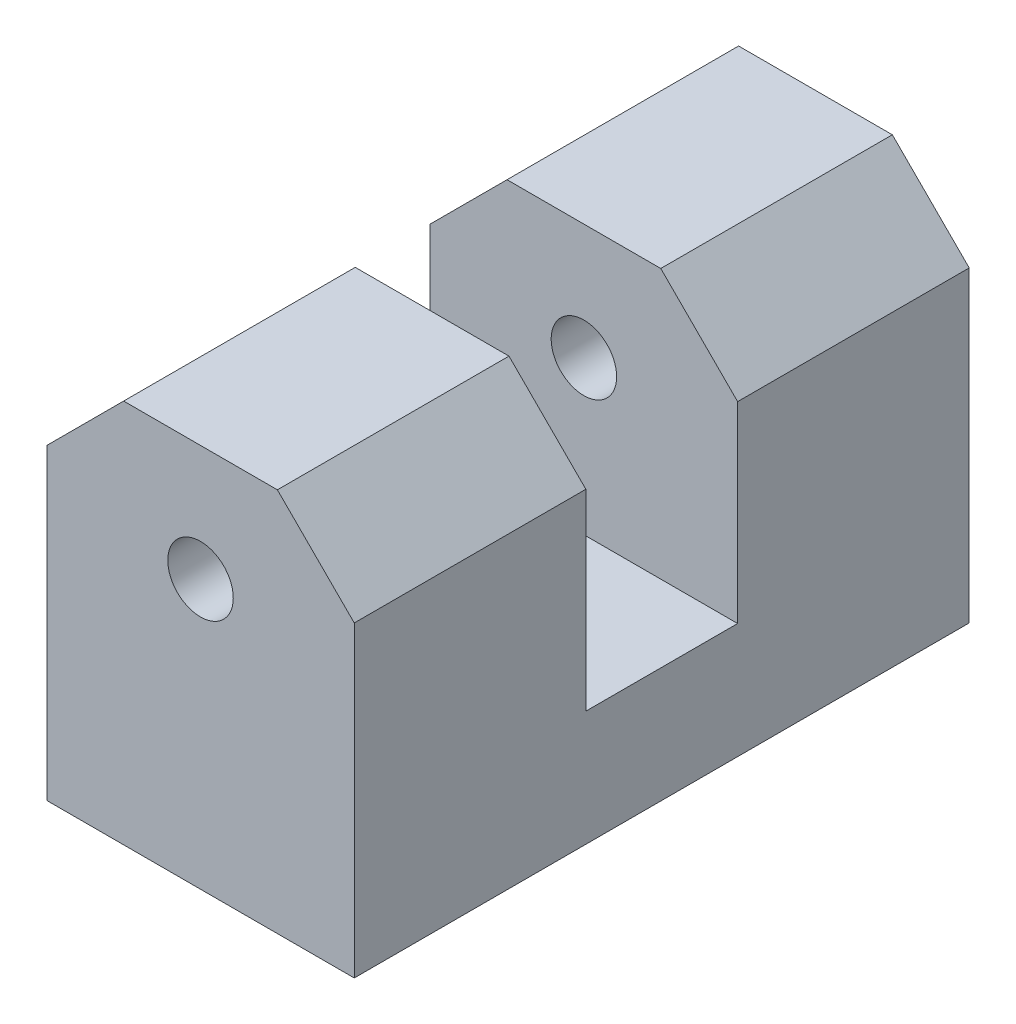
ISO-10303-21;
HEADER;
FILE_DESCRIPTION(('STEP AP214'),'2;1');
FILE_NAME('part.step','',(''),(''),'','','');
FILE_SCHEMA(('AUTOMOTIVE_DESIGN { 1 0 10303 214 1 1 1 1 }'));
ENDSEC;
DATA;
#1=APPLICATION_CONTEXT('core data for automotive mechanical design processes');
#2=APPLICATION_PROTOCOL_DEFINITION('international standard','automotive_design',2000,#1);
#3=PRODUCT_CONTEXT('',#1,'mechanical');
#4=PRODUCT('Part','Part','',(#3));
#5=PRODUCT_RELATED_PRODUCT_CATEGORY('part','',(#4));
#6=PRODUCT_DEFINITION_FORMATION('','',#4);
#7=PRODUCT_DEFINITION_CONTEXT('part definition',#1,'design');
#8=PRODUCT_DEFINITION('design','',#6,#7);
#9=PRODUCT_DEFINITION_SHAPE('','',#8);
#10=(LENGTH_UNIT() NAMED_UNIT(*) SI_UNIT(.MILLI.,.METRE.));
#11=(NAMED_UNIT(*) PLANE_ANGLE_UNIT() SI_UNIT($,.RADIAN.));
#12=(NAMED_UNIT(*) SI_UNIT($,.STERADIAN.) SOLID_ANGLE_UNIT());
#13=UNCERTAINTY_MEASURE_WITH_UNIT(LENGTH_MEASURE(1.E-05),#10,'distance_accuracy_value','');
#14=(GEOMETRIC_REPRESENTATION_CONTEXT(3) GLOBAL_UNCERTAINTY_ASSIGNED_CONTEXT((#13)) GLOBAL_UNIT_ASSIGNED_CONTEXT((#10,
#11,#12)) REPRESENTATION_CONTEXT('',''));
#15=CARTESIAN_POINT('',(0.,0.,0.));
#16=DIRECTION('',(0.,0.,1.));
#17=DIRECTION('',(1.,0.,0.));
#18=AXIS2_PLACEMENT_3D('',#15,#16,#17);
#19=CARTESIAN_POINT('',(4.,10.,8.));
#20=DIRECTION('',(0.,1.,0.));
#21=DIRECTION('',(0.,0.,1.));
#22=AXIS2_PLACEMENT_3D('',#19,#20,#21);
#23=PLANE('',#22);
#24=DIRECTION('',(1.,0.,0.));
#25=VECTOR('',#24,1.);
#26=CARTESIAN_POINT('',(-5.61776706642842,10.,1.97454128412999));
#27=LINE('',#26,#25);
#28=CARTESIAN_POINT('',(-2.,10.,1.97454128412999));
#29=VERTEX_POINT('',#28);
#30=CARTESIAN_POINT('',(2.00000000000001,10.,1.97454128412999));
#31=VERTEX_POINT('',#30);
#32=EDGE_CURVE('E144',#29,#31,#27,.T.);
#33=ORIENTED_EDGE('',*,*,#32,.F.);
#34=DIRECTION('',(0.,0.,1.));
#35=VECTOR('',#34,1.);
#36=CARTESIAN_POINT('',(-2.,10.,8.));
#37=LINE('',#36,#35);
#38=CARTESIAN_POINT('',(-2.,10.,8.));
#39=VERTEX_POINT('',#38);
#40=EDGE_CURVE('E214',#29,#39,#37,.T.);
#41=ORIENTED_EDGE('',*,*,#40,.T.);
#42=DIRECTION('',(1.,0.,0.));
#43=VECTOR('',#42,1.);
#44=CARTESIAN_POINT('',(-4.,10.,8.));
#45=LINE('',#44,#43);
#46=CARTESIAN_POINT('',(2.00000000000001,10.,8.));
#47=VERTEX_POINT('',#46);
#48=EDGE_CURVE('E165',#39,#47,#45,.T.);
#49=ORIENTED_EDGE('',*,*,#48,.T.);
#50=DIRECTION('',(0.,0.,-1.));
#51=VECTOR('',#50,1.);
#52=CARTESIAN_POINT('',(2.00000000000001,10.,1.97454128412999));
#53=LINE('',#52,#51);
#54=EDGE_CURVE('E211',#47,#31,#53,.T.);
#55=ORIENTED_EDGE('',*,*,#54,.T.);
#56=EDGE_LOOP('',(#33,#41,#49,#55));
#57=FACE_BOUND('',#56,.T.);
#58=ADVANCED_FACE('F31',(#57),#23,.T.);
#59=CARTESIAN_POINT('',(0.,6.98638723737771,-8.));
#60=DIRECTION('',(0.,0.,1.));
#61=DIRECTION('',(1.,0.,0.));
#62=AXIS2_PLACEMENT_3D('',#59,#60,#61);
#63=CYLINDRICAL_SURFACE('',#62,0.852);
#64=CARTESIAN_POINT('',(0.,6.98638723737771,1.97454128412999));
#65=DIRECTION('',(0.,0.,1.));
#66=DIRECTION('',(1.,0.,0.));
#67=AXIS2_PLACEMENT_3D('',#64,#65,#66);
#68=CIRCLE('',#67,0.852);
#69=CARTESIAN_POINT('',(0.852000000000002,6.98638723737771,1.97454128412999));
#70=VERTEX_POINT('',#69);
#71=EDGE_CURVE('E126',#70,#70,#68,.F.);
#72=ORIENTED_EDGE('',*,*,#71,.T.);
#73=EDGE_LOOP('',(#72));
#74=FACE_BOUND('',#73,.T.);
#75=CARTESIAN_POINT('',(0.,6.98638723737771,8.));
#76=DIRECTION('',(0.,0.,1.));
#77=DIRECTION('',(1.,0.,0.));
#78=AXIS2_PLACEMENT_3D('',#75,#76,#77);
#79=CIRCLE('',#78,0.852);
#80=CARTESIAN_POINT('',(0.852000000000002,6.98638723737771,8.));
#81=VERTEX_POINT('',#80);
#82=EDGE_CURVE('E138',#81,#81,#79,.T.);
#83=ORIENTED_EDGE('',*,*,#82,.T.);
#84=EDGE_LOOP('',(#83));
#85=FACE_BOUND('',#84,.T.);
#86=ADVANCED_FACE('F255',(#74,#85),#63,.F.);
#87=CARTESIAN_POINT('',(4.,10.,-8.));
#88=DIRECTION('',(-1.,0.,0.));
#89=DIRECTION('',(0.,0.,1.));
#90=AXIS2_PLACEMENT_3D('',#87,#88,#89);
#91=PLANE('',#90);
#92=DIRECTION('',(0.,-1.,0.));
#93=VECTOR('',#92,1.);
#94=CARTESIAN_POINT('',(4.,10.,-8.));
#95=LINE('',#94,#93);
#96=CARTESIAN_POINT('',(4.,7.99999999999999,-8.));
#97=VERTEX_POINT('',#96);
#98=CARTESIAN_POINT('',(4.,0.,-8.));
#99=VERTEX_POINT('',#98);
#100=EDGE_CURVE('E185',#97,#99,#95,.T.);
#101=ORIENTED_EDGE('',*,*,#100,.F.);
#102=DIRECTION('',(0.,0.,1.));
#103=VECTOR('',#102,1.);
#104=CARTESIAN_POINT('',(4.,7.99999999999999,-1.97454128412999));
#105=LINE('',#104,#103);
#106=CARTESIAN_POINT('',(4.,7.99999999999999,-1.97454128412999));
#107=VERTEX_POINT('',#106);
#108=EDGE_CURVE('E11',#97,#107,#105,.T.);
#109=ORIENTED_EDGE('',*,*,#108,.T.);
#110=DIRECTION('',(0.,-1.,0.));
#111=VECTOR('',#110,1.);
#112=CARTESIAN_POINT('',(4.,10.,-1.97454128412999));
#113=LINE('',#112,#111);
#114=CARTESIAN_POINT('',(4.,3.,-1.97454128412999));
#115=VERTEX_POINT('',#114);
#116=EDGE_CURVE('E117',#107,#115,#113,.T.);
#117=ORIENTED_EDGE('',*,*,#116,.T.);
#118=DIRECTION('',(0.,0.,-1.));
#119=VECTOR('',#118,1.);
#120=CARTESIAN_POINT('',(4.,3.,-8.));
#121=LINE('',#120,#119);
#122=CARTESIAN_POINT('',(4.,3.,1.97454128412999));
#123=VERTEX_POINT('',#122);
#124=EDGE_CURVE('E121',#123,#115,#121,.T.);
#125=ORIENTED_EDGE('',*,*,#124,.F.);
#126=DIRECTION('',(0.,1.,0.));
#127=VECTOR('',#126,1.);
#128=CARTESIAN_POINT('',(4.,10.,1.97454128412999));
#129=LINE('',#128,#127);
#130=CARTESIAN_POINT('',(4.,7.99999999999999,1.97454128412999));
#131=VERTEX_POINT('',#130);
#132=EDGE_CURVE('E139',#123,#131,#129,.T.);
#133=ORIENTED_EDGE('',*,*,#132,.T.);
#134=DIRECTION('',(0.,0.,1.));
#135=VECTOR('',#134,1.);
#136=CARTESIAN_POINT('',(4.,7.99999999999999,8.));
#137=LINE('',#136,#135);
#138=CARTESIAN_POINT('',(4.,7.99999999999999,8.));
#139=VERTEX_POINT('',#138);
#140=EDGE_CURVE('E39',#131,#139,#137,.T.);
#141=ORIENTED_EDGE('',*,*,#140,.T.);
#142=DIRECTION('',(0.,-1.,0.));
#143=VECTOR('',#142,1.);
#144=CARTESIAN_POINT('',(4.,10.,8.));
#145=LINE('',#144,#143);
#146=CARTESIAN_POINT('',(4.,0.,8.));
#147=VERTEX_POINT('',#146);
#148=EDGE_CURVE('E169',#139,#147,#145,.T.);
#149=ORIENTED_EDGE('',*,*,#148,.T.);
#150=DIRECTION('',(0.,0.,-1.));
#151=VECTOR('',#150,1.);
#152=CARTESIAN_POINT('',(4.,0.,-8.));
#153=LINE('',#152,#151);
#154=EDGE_CURVE('E159',#147,#99,#153,.T.);
#155=ORIENTED_EDGE('',*,*,#154,.T.);
#156=EDGE_LOOP('',(#101,#109,#117,#125,#133,#141,#149,#155));
#157=FACE_BOUND('',#156,.T.);
#158=ADVANCED_FACE('F120',(#157),#91,.F.);
#159=CARTESIAN_POINT('',(-4.,10.,-8.));
#160=DIRECTION('',(0.,0.,1.));
#161=DIRECTION('',(1.,0.,0.));
#162=AXIS2_PLACEMENT_3D('',#159,#160,#161);
#163=PLANE('',#162);
#164=CARTESIAN_POINT('',(0.,6.98638723737771,-8.));
#165=DIRECTION('',(0.,0.,1.));
#166=DIRECTION('',(1.,0.,0.));
#167=AXIS2_PLACEMENT_3D('',#164,#165,#166);
#168=CIRCLE('',#167,0.852);
#169=CARTESIAN_POINT('',(0.852000000000002,6.98638723737771,-8.));
#170=VERTEX_POINT('',#169);
#171=EDGE_CURVE('E156',#170,#170,#168,.T.);
#172=ORIENTED_EDGE('',*,*,#171,.T.);
#173=EDGE_LOOP('',(#172));
#174=FACE_BOUND('',#173,.T.);
#175=DIRECTION('',(0.,-1.,0.));
#176=VECTOR('',#175,1.);
#177=CARTESIAN_POINT('',(-4.,10.,-8.));
#178=LINE('',#177,#176);
#179=CARTESIAN_POINT('',(-4.,7.99999999999999,-8.));
#180=VERTEX_POINT('',#179);
#181=CARTESIAN_POINT('',(-4.,0.,-8.));
#182=VERTEX_POINT('',#181);
#183=EDGE_CURVE('E183',#180,#182,#178,.T.);
#184=ORIENTED_EDGE('',*,*,#183,.F.);
#185=DIRECTION('',(0.707106781186546,0.707106781186549,0.));
#186=VECTOR('',#185,1.);
#187=CARTESIAN_POINT('',(-2.,10.,-8.));
#188=LINE('',#187,#186);
#189=CARTESIAN_POINT('',(-2.,10.,-8.));
#190=VERTEX_POINT('',#189);
#191=EDGE_CURVE('E209',#180,#190,#188,.T.);
#192=ORIENTED_EDGE('',*,*,#191,.T.);
#193=DIRECTION('',(-1.,0.,0.));
#194=VECTOR('',#193,1.);
#195=CARTESIAN_POINT('',(-4.,10.,-8.));
#196=LINE('',#195,#194);
#197=CARTESIAN_POINT('',(2.,10.,-8.));
#198=VERTEX_POINT('',#197);
#199=EDGE_CURVE('E162',#198,#190,#196,.T.);
#200=ORIENTED_EDGE('',*,*,#199,.F.);
#201=DIRECTION('',(0.707106781186546,-0.707106781186549,0.));
#202=VECTOR('',#201,1.);
#203=CARTESIAN_POINT('',(2.,10.,-8.));
#204=LINE('',#203,#202);
#205=EDGE_CURVE('E207',#198,#97,#204,.T.);
#206=ORIENTED_EDGE('',*,*,#205,.T.);
#207=ORIENTED_EDGE('',*,*,#100,.T.);
#208=DIRECTION('',(-1.,0.,0.));
#209=VECTOR('',#208,1.);
#210=CARTESIAN_POINT('',(-4.,0.,-8.));
#211=LINE('',#210,#209);
#212=EDGE_CURVE('E172',#99,#182,#211,.T.);
#213=ORIENTED_EDGE('',*,*,#212,.T.);
#214=EDGE_LOOP('',(#184,#192,#200,#206,#207,#213));
#215=FACE_BOUND('',#214,.T.);
#216=ADVANCED_FACE('F282',(#174,#215),#163,.F.);
#217=CARTESIAN_POINT('',(-4.,10.,-8.));
#218=DIRECTION('',(1.,0.,0.));
#219=DIRECTION('',(0.,0.,-1.));
#220=AXIS2_PLACEMENT_3D('',#217,#218,#219);
#221=PLANE('',#220);
#222=DIRECTION('',(0.,1.,0.));
#223=VECTOR('',#222,1.);
#224=CARTESIAN_POINT('',(-4.,10.,-1.97454128412999));
#225=LINE('',#224,#223);
#226=CARTESIAN_POINT('',(-4.,3.,-1.97454128412999));
#227=VERTEX_POINT('',#226);
#228=CARTESIAN_POINT('',(-4.,7.99999999999999,-1.97454128412999));
#229=VERTEX_POINT('',#228);
#230=EDGE_CURVE('E127',#227,#229,#225,.T.);
#231=ORIENTED_EDGE('',*,*,#230,.T.);
#232=DIRECTION('',(0.,0.,-1.));
#233=VECTOR('',#232,1.);
#234=CARTESIAN_POINT('',(-4.,7.99999999999999,-8.));
#235=LINE('',#234,#233);
#236=EDGE_CURVE('E205',#229,#180,#235,.T.);
#237=ORIENTED_EDGE('',*,*,#236,.T.);
#238=ORIENTED_EDGE('',*,*,#183,.T.);
#239=DIRECTION('',(0.,0.,1.));
#240=VECTOR('',#239,1.);
#241=CARTESIAN_POINT('',(-4.,0.,-8.));
#242=LINE('',#241,#240);
#243=CARTESIAN_POINT('',(-4.,0.,8.));
#244=VERTEX_POINT('',#243);
#245=EDGE_CURVE('E175',#182,#244,#242,.T.);
#246=ORIENTED_EDGE('',*,*,#245,.T.);
#247=DIRECTION('',(0.,-1.,0.));
#248=VECTOR('',#247,1.);
#249=CARTESIAN_POINT('',(-4.,10.,8.));
#250=LINE('',#249,#248);
#251=CARTESIAN_POINT('',(-4.,7.99999999999999,8.));
#252=VERTEX_POINT('',#251);
#253=EDGE_CURVE('E181',#252,#244,#250,.T.);
#254=ORIENTED_EDGE('',*,*,#253,.F.);
#255=DIRECTION('',(0.,0.,-1.));
#256=VECTOR('',#255,1.);
#257=CARTESIAN_POINT('',(-4.,7.99999999999999,1.97454128412999));
#258=LINE('',#257,#256);
#259=CARTESIAN_POINT('',(-4.,7.99999999999999,1.97454128412999));
#260=VERTEX_POINT('',#259);
#261=EDGE_CURVE('E203',#252,#260,#258,.T.);
#262=ORIENTED_EDGE('',*,*,#261,.T.);
#263=DIRECTION('',(0.,-1.,0.));
#264=VECTOR('',#263,1.);
#265=CARTESIAN_POINT('',(-4.,10.,1.97454128412999));
#266=LINE('',#265,#264);
#267=CARTESIAN_POINT('',(-4.,3.,1.97454128412999));
#268=VERTEX_POINT('',#267);
#269=EDGE_CURVE('E153',#260,#268,#266,.T.);
#270=ORIENTED_EDGE('',*,*,#269,.T.);
#271=DIRECTION('',(0.,0.,1.));
#272=VECTOR('',#271,1.);
#273=CARTESIAN_POINT('',(-4.,3.,-8.));
#274=LINE('',#273,#272);
#275=EDGE_CURVE('E187',#227,#268,#274,.T.);
#276=ORIENTED_EDGE('',*,*,#275,.F.);
#277=EDGE_LOOP('',(#231,#237,#238,#246,#254,#262,#270,#276));
#278=FACE_BOUND('',#277,.T.);
#279=ADVANCED_FACE('F238',(#278),#221,.F.);
#280=CARTESIAN_POINT('',(-4.,10.,8.));
#281=DIRECTION('',(0.,0.,-1.));
#282=DIRECTION('',(-1.,0.,0.));
#283=AXIS2_PLACEMENT_3D('',#280,#281,#282);
#284=PLANE('',#283);
#285=ORIENTED_EDGE('',*,*,#82,.F.);
#286=EDGE_LOOP('',(#285));
#287=FACE_BOUND('',#286,.T.);
#288=ORIENTED_EDGE('',*,*,#48,.F.);
#289=DIRECTION('',(-0.707106781186546,-0.707106781186549,0.));
#290=VECTOR('',#289,1.);
#291=CARTESIAN_POINT('',(-2.,10.,8.));
#292=LINE('',#291,#290);
#293=EDGE_CURVE('E219',#39,#252,#292,.T.);
#294=ORIENTED_EDGE('',*,*,#293,.T.);
#295=ORIENTED_EDGE('',*,*,#253,.T.);
#296=DIRECTION('',(1.,0.,0.));
#297=VECTOR('',#296,1.);
#298=CARTESIAN_POINT('',(-4.,0.,8.));
#299=LINE('',#298,#297);
#300=EDGE_CURVE('E166',#244,#147,#299,.T.);
#301=ORIENTED_EDGE('',*,*,#300,.T.);
#302=ORIENTED_EDGE('',*,*,#148,.F.);
#303=DIRECTION('',(-0.707106781186546,0.707106781186549,0.));
#304=VECTOR('',#303,1.);
#305=CARTESIAN_POINT('',(2.00000000000001,10.,8.));
#306=LINE('',#305,#304);
#307=EDGE_CURVE('E217',#139,#47,#306,.T.);
#308=ORIENTED_EDGE('',*,*,#307,.T.);
#309=EDGE_LOOP('',(#288,#294,#295,#301,#302,#308));
#310=FACE_BOUND('',#309,.T.);
#311=ADVANCED_FACE('F236',(#287,#310),#284,.F.);
#312=ORIENTED_EDGE('',*,*,#199,.T.);
#313=DIRECTION('',(0.,0.,1.));
#314=VECTOR('',#313,1.);
#315=CARTESIAN_POINT('',(-2.,10.,-1.97454128412999));
#316=LINE('',#315,#314);
#317=CARTESIAN_POINT('',(-2.,10.,-1.97454128412999));
#318=VERTEX_POINT('',#317);
#319=EDGE_CURVE('E196',#190,#318,#316,.T.);
#320=ORIENTED_EDGE('',*,*,#319,.T.);
#321=DIRECTION('',(-1.,0.,0.));
#322=VECTOR('',#321,1.);
#323=CARTESIAN_POINT('',(-5.61776706642842,10.,-1.97454128412999));
#324=LINE('',#323,#322);
#325=CARTESIAN_POINT('',(2.,10.,-1.97454128412999));
#326=VERTEX_POINT('',#325);
#327=EDGE_CURVE('E148',#326,#318,#324,.T.);
#328=ORIENTED_EDGE('',*,*,#327,.F.);
#329=DIRECTION('',(0.,0.,-1.));
#330=VECTOR('',#329,1.);
#331=CARTESIAN_POINT('',(2.,10.,-8.));
#332=LINE('',#331,#330);
#333=EDGE_CURVE('E193',#326,#198,#332,.T.);
#334=ORIENTED_EDGE('',*,*,#333,.T.);
#335=EDGE_LOOP('',(#312,#320,#328,#334));
#336=FACE_BOUND('',#335,.T.);
#337=ADVANCED_FACE('F257',(#336),#23,.T.);
#338=CARTESIAN_POINT('',(4.,0.,8.));
#339=DIRECTION('',(0.,1.,0.));
#340=DIRECTION('',(0.,0.,1.));
#341=AXIS2_PLACEMENT_3D('',#338,#339,#340);
#342=PLANE('',#341);
#343=ORIENTED_EDGE('',*,*,#154,.F.);
#344=ORIENTED_EDGE('',*,*,#300,.F.);
#345=ORIENTED_EDGE('',*,*,#245,.F.);
#346=ORIENTED_EDGE('',*,*,#212,.F.);
#347=EDGE_LOOP('',(#343,#344,#345,#346));
#348=FACE_BOUND('',#347,.T.);
#349=ADVANCED_FACE('F245',(#348),#342,.F.);
#350=CARTESIAN_POINT('',(0.,6.98638723737771,-1.97454128412999));
#351=DIRECTION('',(0.,0.,-1.));
#352=DIRECTION('',(-1.,0.,0.));
#353=AXIS2_PLACEMENT_3D('',#350,#351,#352);
#354=CIRCLE('',#353,0.852);
#355=CARTESIAN_POINT('',(-0.851999999999998,6.98638723737771,-1.97454128412999));
#356=VERTEX_POINT('',#355);
#357=EDGE_CURVE('E146',#356,#356,#354,.F.);
#358=ORIENTED_EDGE('',*,*,#357,.T.);
#359=EDGE_LOOP('',(#358));
#360=FACE_BOUND('',#359,.T.);
#361=ORIENTED_EDGE('',*,*,#171,.F.);
#362=EDGE_LOOP('',(#361));
#363=FACE_BOUND('',#362,.T.);
#364=ADVANCED_FACE('F263',(#360,#363),#63,.F.);
#365=CARTESIAN_POINT('',(5.61776706642842,3.,1.97454128412999));
#366=DIRECTION('',(0.,1.,0.));
#367=DIRECTION('',(0.,0.,1.));
#368=AXIS2_PLACEMENT_3D('',#365,#366,#367);
#369=PLANE('',#368);
#370=ORIENTED_EDGE('',*,*,#124,.T.);
#371=DIRECTION('',(-1.,0.,0.));
#372=VECTOR('',#371,1.);
#373=CARTESIAN_POINT('',(-5.61776706642842,3.,-1.97454128412999));
#374=LINE('',#373,#372);
#375=EDGE_CURVE('E134',#115,#227,#374,.T.);
#376=ORIENTED_EDGE('',*,*,#375,.T.);
#377=ORIENTED_EDGE('',*,*,#275,.T.);
#378=DIRECTION('',(1.,0.,0.));
#379=VECTOR('',#378,1.);
#380=CARTESIAN_POINT('',(-5.61776706642842,3.,1.97454128412999));
#381=LINE('',#380,#379);
#382=EDGE_CURVE('E137',#268,#123,#381,.T.);
#383=ORIENTED_EDGE('',*,*,#382,.T.);
#384=EDGE_LOOP('',(#370,#376,#377,#383));
#385=FACE_BOUND('',#384,.T.);
#386=ADVANCED_FACE('F132',(#385),#369,.T.);
#387=CARTESIAN_POINT('',(-5.61776706642842,3.,1.97454128412999));
#388=DIRECTION('',(0.,0.,1.));
#389=DIRECTION('',(1.,0.,0.));
#390=AXIS2_PLACEMENT_3D('',#387,#388,#389);
#391=PLANE('',#390);
#392=ORIENTED_EDGE('',*,*,#71,.F.);
#393=EDGE_LOOP('',(#392));
#394=FACE_BOUND('',#393,.T.);
#395=ORIENTED_EDGE('',*,*,#269,.F.);
#396=DIRECTION('',(0.707106781186546,0.707106781186549,0.));
#397=VECTOR('',#396,1.);
#398=CARTESIAN_POINT('',(-2.,10.,1.97454128412999));
#399=LINE('',#398,#397);
#400=EDGE_CURVE('E222',#260,#29,#399,.T.);
#401=ORIENTED_EDGE('',*,*,#400,.T.);
#402=ORIENTED_EDGE('',*,*,#32,.T.);
#403=DIRECTION('',(0.707106781186546,-0.707106781186549,0.));
#404=VECTOR('',#403,1.);
#405=CARTESIAN_POINT('',(2.00000000000001,10.,1.97454128412999));
#406=LINE('',#405,#404);
#407=EDGE_CURVE('E46',#31,#131,#406,.T.);
#408=ORIENTED_EDGE('',*,*,#407,.T.);
#409=ORIENTED_EDGE('',*,*,#132,.F.);
#410=ORIENTED_EDGE('',*,*,#382,.F.);
#411=EDGE_LOOP('',(#395,#401,#402,#408,#409,#410));
#412=FACE_BOUND('',#411,.T.);
#413=ADVANCED_FACE('F226',(#394,#412),#391,.F.);
#414=CARTESIAN_POINT('',(-5.61776706642842,3.,-1.97454128412999));
#415=DIRECTION('',(0.,0.,-1.));
#416=DIRECTION('',(-1.,0.,0.));
#417=AXIS2_PLACEMENT_3D('',#414,#415,#416);
#418=PLANE('',#417);
#419=ORIENTED_EDGE('',*,*,#357,.F.);
#420=EDGE_LOOP('',(#419));
#421=FACE_BOUND('',#420,.T.);
#422=ORIENTED_EDGE('',*,*,#327,.T.);
#423=DIRECTION('',(-0.707106781186546,-0.707106781186549,0.));
#424=VECTOR('',#423,1.);
#425=CARTESIAN_POINT('',(-2.,10.,-1.97454128412999));
#426=LINE('',#425,#424);
#427=EDGE_CURVE('E201',#318,#229,#426,.T.);
#428=ORIENTED_EDGE('',*,*,#427,.T.);
#429=ORIENTED_EDGE('',*,*,#230,.F.);
#430=ORIENTED_EDGE('',*,*,#375,.F.);
#431=ORIENTED_EDGE('',*,*,#116,.F.);
#432=DIRECTION('',(-0.707106781186546,0.707106781186549,0.));
#433=VECTOR('',#432,1.);
#434=CARTESIAN_POINT('',(2.,10.,-1.97454128412999));
#435=LINE('',#434,#433);
#436=EDGE_CURVE('E199',#107,#326,#435,.T.);
#437=ORIENTED_EDGE('',*,*,#436,.T.);
#438=EDGE_LOOP('',(#422,#428,#429,#430,#431,#437));
#439=FACE_BOUND('',#438,.T.);
#440=ADVANCED_FACE('F142',(#421,#439),#418,.F.);
#441=CARTESIAN_POINT('',(-2.,10.,8.));
#442=DIRECTION('',(-0.707106781186549,0.707106781186546,0.));
#443=DIRECTION('',(-0.707106781186546,-0.707106781186549,0.));
#444=AXIS2_PLACEMENT_3D('',#441,#442,#443);
#445=PLANE('',#444);
#446=ORIENTED_EDGE('',*,*,#191,.F.);
#447=ORIENTED_EDGE('',*,*,#236,.F.);
#448=ORIENTED_EDGE('',*,*,#427,.F.);
#449=ORIENTED_EDGE('',*,*,#319,.F.);
#450=EDGE_LOOP('',(#446,#447,#448,#449));
#451=FACE_BOUND('',#450,.T.);
#452=ADVANCED_FACE('F280',(#451),#445,.T.);
#453=CARTESIAN_POINT('',(-2.,10.,8.));
#454=DIRECTION('',(-0.707106781186549,0.707106781186546,0.));
#455=DIRECTION('',(-0.707106781186546,-0.707106781186549,0.));
#456=AXIS2_PLACEMENT_3D('',#453,#454,#455);
#457=PLANE('',#456);
#458=ORIENTED_EDGE('',*,*,#400,.F.);
#459=ORIENTED_EDGE('',*,*,#261,.F.);
#460=ORIENTED_EDGE('',*,*,#293,.F.);
#461=ORIENTED_EDGE('',*,*,#40,.F.);
#462=EDGE_LOOP('',(#458,#459,#460,#461));
#463=FACE_BOUND('',#462,.T.);
#464=ADVANCED_FACE('F233',(#463),#457,.T.);
#465=CARTESIAN_POINT('',(2.,10.,8.));
#466=DIRECTION('',(0.707106781186549,0.707106781186546,0.));
#467=DIRECTION('',(-0.707106781186546,0.707106781186549,0.));
#468=AXIS2_PLACEMENT_3D('',#465,#466,#467);
#469=PLANE('',#468);
#470=ORIENTED_EDGE('',*,*,#436,.F.);
#471=ORIENTED_EDGE('',*,*,#108,.F.);
#472=ORIENTED_EDGE('',*,*,#205,.F.);
#473=ORIENTED_EDGE('',*,*,#333,.F.);
#474=EDGE_LOOP('',(#470,#471,#472,#473));
#475=FACE_BOUND('',#474,.T.);
#476=ADVANCED_FACE('F249',(#475),#469,.T.);
#477=CARTESIAN_POINT('',(2.00000000000001,10.,8.));
#478=DIRECTION('',(0.707106781186549,0.707106781186546,0.));
#479=DIRECTION('',(-0.707106781186546,0.707106781186549,0.));
#480=AXIS2_PLACEMENT_3D('',#477,#478,#479);
#481=PLANE('',#480);
#482=ORIENTED_EDGE('',*,*,#307,.F.);
#483=ORIENTED_EDGE('',*,*,#140,.F.);
#484=ORIENTED_EDGE('',*,*,#407,.F.);
#485=ORIENTED_EDGE('',*,*,#54,.F.);
#486=EDGE_LOOP('',(#482,#483,#484,#485));
#487=FACE_BOUND('',#486,.T.);
#488=ADVANCED_FACE('F33',(#487),#481,.T.);
#489=CLOSED_SHELL('',(#58,#86,#158,#216,#279,#311,#337,#349,#364,#386,#413,#440,#452,#464,#476,#488));
#490=MANIFOLD_SOLID_BREP('B2',#489);
#491=ADVANCED_BREP_SHAPE_REPRESENTATION('',(#18,#490),#14);
#492=SHAPE_DEFINITION_REPRESENTATION(#9,#491);
ENDSEC;
END-ISO-10303-21;
